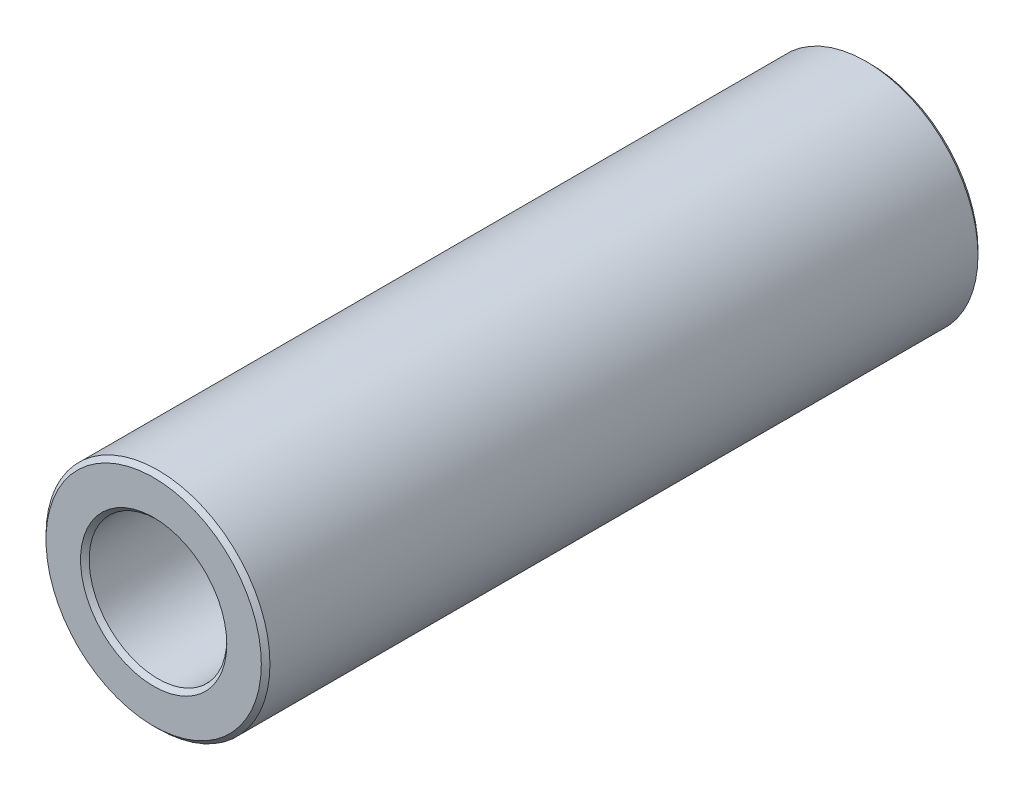
ISO-10303-21;
HEADER;
FILE_DESCRIPTION(('STEP AP214'),'2;1');
FILE_NAME('part.step','',(''),(''),'','','');
FILE_SCHEMA(('AUTOMOTIVE_DESIGN { 1 0 10303 214 1 1 1 1 }'));
ENDSEC;
DATA;
#1=APPLICATION_CONTEXT('core data for automotive mechanical design processes');
#2=APPLICATION_PROTOCOL_DEFINITION('international standard','automotive_design',2000,#1);
#3=PRODUCT_CONTEXT('',#1,'mechanical');
#4=PRODUCT('Part','Part','',(#3));
#5=PRODUCT_RELATED_PRODUCT_CATEGORY('part','',(#4));
#6=PRODUCT_DEFINITION_FORMATION('','',#4);
#7=PRODUCT_DEFINITION_CONTEXT('part definition',#1,'design');
#8=PRODUCT_DEFINITION('design','',#6,#7);
#9=PRODUCT_DEFINITION_SHAPE('','',#8);
#10=(LENGTH_UNIT() NAMED_UNIT(*) SI_UNIT(.MILLI.,.METRE.));
#11=(NAMED_UNIT(*) PLANE_ANGLE_UNIT() SI_UNIT($,.RADIAN.));
#12=(NAMED_UNIT(*) SI_UNIT($,.STERADIAN.) SOLID_ANGLE_UNIT());
#13=UNCERTAINTY_MEASURE_WITH_UNIT(LENGTH_MEASURE(1.E-05),#10,'distance_accuracy_value','');
#14=(GEOMETRIC_REPRESENTATION_CONTEXT(3) GLOBAL_UNCERTAINTY_ASSIGNED_CONTEXT((#13)) GLOBAL_UNIT_ASSIGNED_CONTEXT((#10,
#11,#12)) REPRESENTATION_CONTEXT('',''));
#15=CARTESIAN_POINT('',(0.,0.,0.));
#16=DIRECTION('',(0.,0.,1.));
#17=DIRECTION('',(1.,0.,0.));
#18=AXIS2_PLACEMENT_3D('',#15,#16,#17);
#19=CARTESIAN_POINT('',(0.,0.,-12.7));
#20=DIRECTION('',(0.,0.,1.));
#21=DIRECTION('',(1.,0.,0.));
#22=AXIS2_PLACEMENT_3D('',#19,#20,#21);
#23=CYLINDRICAL_SURFACE('',#22,3.96875);
#24=CARTESIAN_POINT('',(0.,0.,12.546965));
#25=DIRECTION('',(0.,0.,1.));
#26=DIRECTION('',(1.,0.,0.));
#27=AXIS2_PLACEMENT_3D('',#24,#25,#26);
#28=CIRCLE('',#27,3.96875);
#29=CARTESIAN_POINT('',(3.96875,0.,12.546965));
#30=VERTEX_POINT('',#29);
#31=EDGE_CURVE('E50',#30,#30,#28,.F.);
#32=ORIENTED_EDGE('',*,*,#31,.T.);
#33=EDGE_LOOP('',(#32));
#34=FACE_BOUND('',#33,.T.);
#35=CARTESIAN_POINT('',(0.,0.,-12.546965));
#36=DIRECTION('',(0.,0.,1.));
#37=DIRECTION('',(1.,0.,0.));
#38=AXIS2_PLACEMENT_3D('',#35,#36,#37);
#39=CIRCLE('',#38,3.96875);
#40=CARTESIAN_POINT('',(3.96875,0.,-12.546965));
#41=VERTEX_POINT('',#40);
#42=EDGE_CURVE('E53',#41,#41,#39,.T.);
#43=ORIENTED_EDGE('',*,*,#42,.T.);
#44=EDGE_LOOP('',(#43));
#45=FACE_BOUND('',#44,.T.);
#46=ADVANCED_FACE('F30',(#34,#45),#23,.T.);
#47=CARTESIAN_POINT('',(0.,0.,-12.7));
#48=DIRECTION('',(0.,0.,1.));
#49=DIRECTION('',(1.,0.,0.));
#50=AXIS2_PLACEMENT_3D('',#47,#48,#49);
#51=PLANE('',#50);
#52=CARTESIAN_POINT('',(0.,0.,-12.7));
#53=DIRECTION('',(0.,0.,1.));
#54=DIRECTION('',(1.,0.,0.));
#55=AXIS2_PLACEMENT_3D('',#52,#53,#54);
#56=CIRCLE('',#55,3.81571499999999);
#57=CARTESIAN_POINT('',(3.81571499999999,0.,-12.7));
#58=VERTEX_POINT('',#57);
#59=EDGE_CURVE('E41',#58,#58,#56,.F.);
#60=ORIENTED_EDGE('',*,*,#59,.T.);
#61=EDGE_LOOP('',(#60));
#62=FACE_BOUND('',#61,.T.);
#63=CARTESIAN_POINT('',(0.,0.,-12.7));
#64=DIRECTION('',(0.,0.,1.));
#65=DIRECTION('',(1.,0.,0.));
#66=AXIS2_PLACEMENT_3D('',#63,#64,#65);
#67=CIRCLE('',#66,2.591435);
#68=CARTESIAN_POINT('',(2.591435,0.,-12.7));
#69=VERTEX_POINT('',#68);
#70=EDGE_CURVE('E45',#69,#69,#67,.T.);
#71=ORIENTED_EDGE('',*,*,#70,.T.);
#72=EDGE_LOOP('',(#71));
#73=FACE_BOUND('',#72,.T.);
#74=ADVANCED_FACE('F78',(#62,#73),#51,.F.);
#75=CARTESIAN_POINT('',(0.,0.,-12.7));
#76=DIRECTION('',(0.,0.,1.));
#77=DIRECTION('',(1.,0.,0.));
#78=AXIS2_PLACEMENT_3D('',#75,#76,#77);
#79=CYLINDRICAL_SURFACE('',#78,2.4384);
#80=CARTESIAN_POINT('',(0.,0.,12.546965));
#81=DIRECTION('',(0.,0.,1.));
#82=DIRECTION('',(1.,0.,0.));
#83=AXIS2_PLACEMENT_3D('',#80,#81,#82);
#84=CIRCLE('',#83,2.4384);
#85=CARTESIAN_POINT('',(2.4384,0.,12.546965));
#86=VERTEX_POINT('',#85);
#87=EDGE_CURVE('E10',#86,#86,#84,.T.);
#88=ORIENTED_EDGE('',*,*,#87,.T.);
#89=EDGE_LOOP('',(#88));
#90=FACE_BOUND('',#89,.T.);
#91=CARTESIAN_POINT('',(0.,0.,-12.546965));
#92=DIRECTION('',(0.,0.,1.));
#93=DIRECTION('',(1.,0.,0.));
#94=AXIS2_PLACEMENT_3D('',#91,#92,#93);
#95=CIRCLE('',#94,2.4384);
#96=CARTESIAN_POINT('',(2.4384,0.,-12.546965));
#97=VERTEX_POINT('',#96);
#98=EDGE_CURVE('E37',#97,#97,#95,.F.);
#99=ORIENTED_EDGE('',*,*,#98,.T.);
#100=EDGE_LOOP('',(#99));
#101=FACE_BOUND('',#100,.T.);
#102=ADVANCED_FACE('F84',(#90,#101),#79,.F.);
#103=CARTESIAN_POINT('',(0.,0.,12.7));
#104=DIRECTION('',(0.,0.,1.));
#105=DIRECTION('',(1.,0.,0.));
#106=AXIS2_PLACEMENT_3D('',#103,#104,#105);
#107=PLANE('',#106);
#108=CARTESIAN_POINT('',(0.,0.,12.7));
#109=DIRECTION('',(0.,0.,1.));
#110=DIRECTION('',(1.,0.,0.));
#111=AXIS2_PLACEMENT_3D('',#108,#109,#110);
#112=CIRCLE('',#111,3.815715);
#113=CARTESIAN_POINT('',(3.815715,0.,12.7));
#114=VERTEX_POINT('',#113);
#115=EDGE_CURVE('E56',#114,#114,#112,.T.);
#116=ORIENTED_EDGE('',*,*,#115,.T.);
#117=EDGE_LOOP('',(#116));
#118=FACE_BOUND('',#117,.T.);
#119=CARTESIAN_POINT('',(0.,0.,12.7));
#120=DIRECTION('',(0.,0.,1.));
#121=DIRECTION('',(1.,0.,0.));
#122=AXIS2_PLACEMENT_3D('',#119,#120,#121);
#123=CIRCLE('',#122,2.591435);
#124=CARTESIAN_POINT('',(2.591435,0.,12.7));
#125=VERTEX_POINT('',#124);
#126=EDGE_CURVE('E59',#125,#125,#123,.F.);
#127=ORIENTED_EDGE('',*,*,#126,.T.);
#128=EDGE_LOOP('',(#127));
#129=FACE_BOUND('',#128,.T.);
#130=ADVANCED_FACE('F63',(#118,#129),#107,.T.);
#131=CARTESIAN_POINT('',(0.,0.,12.7));
#132=DIRECTION('',(0.,0.,-1.));
#133=DIRECTION('',(-1.,0.,0.));
#134=AXIS2_PLACEMENT_3D('',#131,#132,#133);
#135=CONICAL_SURFACE('',#134,3.815715,0.785398163397437);
#136=ORIENTED_EDGE('',*,*,#31,.F.);
#137=EDGE_LOOP('',(#136));
#138=FACE_BOUND('',#137,.T.);
#139=ORIENTED_EDGE('',*,*,#115,.F.);
#140=EDGE_LOOP('',(#139));
#141=FACE_BOUND('',#140,.T.);
#142=ADVANCED_FACE('F74',(#138,#141),#135,.T.);
#143=CARTESIAN_POINT('',(0.,0.,-12.546965));
#144=DIRECTION('',(0.,0.,1.));
#145=DIRECTION('',(1.,0.,0.));
#146=AXIS2_PLACEMENT_3D('',#143,#144,#145);
#147=CONICAL_SURFACE('',#146,3.96875,0.785398163397448);
#148=ORIENTED_EDGE('',*,*,#59,.F.);
#149=EDGE_LOOP('',(#148));
#150=FACE_BOUND('',#149,.T.);
#151=ORIENTED_EDGE('',*,*,#42,.F.);
#152=EDGE_LOOP('',(#151));
#153=FACE_BOUND('',#152,.T.);
#154=ADVANCED_FACE('F68',(#150,#153),#147,.T.);
#155=CARTESIAN_POINT('',(0.,0.,12.546965));
#156=DIRECTION('',(0.,0.,1.));
#157=DIRECTION('',(1.,0.,0.));
#158=AXIS2_PLACEMENT_3D('',#155,#156,#157);
#159=CONICAL_SURFACE('',#158,2.4384,0.78539816339746);
#160=ORIENTED_EDGE('',*,*,#126,.F.);
#161=EDGE_LOOP('',(#160));
#162=FACE_BOUND('',#161,.T.);
#163=ORIENTED_EDGE('',*,*,#87,.F.);
#164=EDGE_LOOP('',(#163));
#165=FACE_BOUND('',#164,.T.);
#166=ADVANCED_FACE('F65',(#162,#165),#159,.F.);
#167=CARTESIAN_POINT('',(0.,0.,-12.7));
#168=DIRECTION('',(0.,0.,-1.));
#169=DIRECTION('',(-1.,0.,0.));
#170=AXIS2_PLACEMENT_3D('',#167,#168,#169);
#171=CONICAL_SURFACE('',#170,2.591435,0.785398163397454);
#172=ORIENTED_EDGE('',*,*,#98,.F.);
#173=EDGE_LOOP('',(#172));
#174=FACE_BOUND('',#173,.T.);
#175=ORIENTED_EDGE('',*,*,#70,.F.);
#176=EDGE_LOOP('',(#175));
#177=FACE_BOUND('',#176,.T.);
#178=ADVANCED_FACE('F32',(#174,#177),#171,.F.);
#179=CLOSED_SHELL('',(#46,#74,#102,#130,#142,#154,#166,#178));
#180=MANIFOLD_SOLID_BREP('B2',#179);
#181=ADVANCED_BREP_SHAPE_REPRESENTATION('',(#18,#180),#14);
#182=SHAPE_DEFINITION_REPRESENTATION(#9,#181);
ENDSEC;
END-ISO-10303-21;
